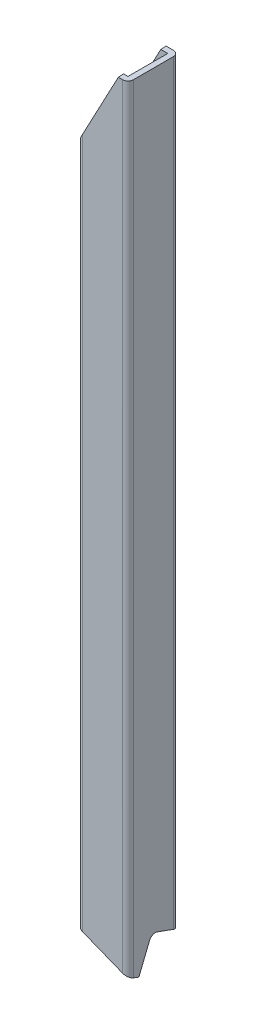
ISO-10303-21;
HEADER;
FILE_DESCRIPTION(('STEP AP214'),'2;1');
FILE_NAME('part.step','',(''),(''),'','','');
FILE_SCHEMA(('AUTOMOTIVE_DESIGN { 1 0 10303 214 1 1 1 1 }'));
ENDSEC;
DATA;
#1=APPLICATION_CONTEXT('core data for automotive mechanical design processes');
#2=APPLICATION_PROTOCOL_DEFINITION('international standard','automotive_design',2000,#1);
#3=PRODUCT_CONTEXT('',#1,'mechanical');
#4=PRODUCT('Part','Part','',(#3));
#5=PRODUCT_RELATED_PRODUCT_CATEGORY('part','',(#4));
#6=PRODUCT_DEFINITION_FORMATION('','',#4);
#7=PRODUCT_DEFINITION_CONTEXT('part definition',#1,'design');
#8=PRODUCT_DEFINITION('design','',#6,#7);
#9=PRODUCT_DEFINITION_SHAPE('','',#8);
#10=(LENGTH_UNIT() NAMED_UNIT(*) SI_UNIT(.MILLI.,.METRE.));
#11=(NAMED_UNIT(*) PLANE_ANGLE_UNIT() SI_UNIT($,.RADIAN.));
#12=(NAMED_UNIT(*) SI_UNIT($,.STERADIAN.) SOLID_ANGLE_UNIT());
#13=UNCERTAINTY_MEASURE_WITH_UNIT(LENGTH_MEASURE(1.E-05),#10,'distance_accuracy_value','');
#14=(GEOMETRIC_REPRESENTATION_CONTEXT(3) GLOBAL_UNCERTAINTY_ASSIGNED_CONTEXT((#13)) GLOBAL_UNIT_ASSIGNED_CONTEXT((#10,
#11,#12)) REPRESENTATION_CONTEXT('',''));
#15=CARTESIAN_POINT('',(0.,0.,0.));
#16=DIRECTION('',(0.,0.,1.));
#17=DIRECTION('',(1.,0.,0.));
#18=AXIS2_PLACEMENT_3D('',#15,#16,#17);
#19=CARTESIAN_POINT('',(0.,395.,2.80000000000002));
#20=DIRECTION('',(1.,0.,0.));
#21=DIRECTION('',(0.,0.,-1.));
#22=AXIS2_PLACEMENT_3D('',#19,#20,#21);
#23=PLANE('',#22);
#24=DIRECTION('',(0.,-0.339781072972034,-0.94050455737863));
#25=VECTOR('',#24,1.);
#26=CARTESIAN_POINT('',(0.,51.5098569819368,126.894506968996));
#27=LINE('',#26,#25);
#28=CARTESIAN_POINT('',(0.,13.9030819897967,22.8));
#29=VERTEX_POINT('',#28);
#30=CARTESIAN_POINT('',(0.,10.738801757909,14.041360347466));
#31=VERTEX_POINT('',#30);
#32=EDGE_CURVE('E50',#29,#31,#27,.T.);
#33=ORIENTED_EDGE('',*,*,#32,.F.);
#34=DIRECTION('',(0.,-1.,0.));
#35=VECTOR('',#34,1.);
#36=CARTESIAN_POINT('',(0.,395.,22.8));
#37=LINE('',#36,#35);
#38=CARTESIAN_POINT('',(0.,356.354468869818,22.8));
#39=VERTEX_POINT('',#38);
#40=EDGE_CURVE('E165',#39,#29,#37,.T.);
#41=ORIENTED_EDGE('',*,*,#40,.F.);
#42=DIRECTION('',(0.,-0.118459331661431,0.992958904860784));
#43=VECTOR('',#42,1.);
#44=CARTESIAN_POINT('',(0.,359.249271627046,-1.46503792728784));
#45=LINE('',#44,#43);
#46=CARTESIAN_POINT('',(0.,358.74045546164,2.80000000000002));
#47=VERTEX_POINT('',#46);
#48=EDGE_CURVE('E193',#47,#39,#45,.T.);
#49=ORIENTED_EDGE('',*,*,#48,.F.);
#50=DIRECTION('',(0.,-1.,0.));
#51=VECTOR('',#50,1.);
#52=CARTESIAN_POINT('',(0.,395.,2.80000000000002));
#53=LINE('',#52,#51);
#54=CARTESIAN_POINT('',(0.,25.0688961405451,2.80000000000002));
#55=VERTEX_POINT('',#54);
#56=EDGE_CURVE('E155',#47,#55,#53,.T.);
#57=ORIENTED_EDGE('',*,*,#56,.T.);
#58=DIRECTION('',(0.,-0.339781072972038,-0.940504557378629));
#59=VECTOR('',#58,1.);
#60=CARTESIAN_POINT('',(0.,67.7778776935013,121.017272787472));
#61=LINE('',#60,#59);
#62=CARTESIAN_POINT('',(0.,25.823172510031,4.88781600699379));
#63=VERTEX_POINT('',#62);
#64=EDGE_CURVE('E133',#63,#55,#61,.T.);
#65=ORIENTED_EDGE('',*,*,#64,.F.);
#66=CARTESIAN_POINT('',(0.,23.050786325766,6.01191657989972));
#67=DIRECTION('',(1.,0.,0.));
#68=DIRECTION('',(0.,0.795445386973202,-0.606025276983604));
#69=AXIS2_PLACEMENT_3D('',#66,#67,#68);
#70=ELLIPSE('',#69,3.0074321650704,2.8);
#71=CARTESIAN_POINT('',(0.,24.0079153506659,8.66122309377898));
#72=VERTEX_POINT('',#71);
#73=EDGE_CURVE('E128',#72,#63,#70,.F.);
#74=ORIENTED_EDGE('',*,*,#73,.F.);
#75=DIRECTION('',(0.,0.926720618835467,-0.375751107284077));
#76=VECTOR('',#75,1.);
#77=CARTESIAN_POINT('',(0.,344.661011065056,-121.351807068595));
#78=LINE('',#77,#76);
#79=EDGE_CURVE('E118',#31,#72,#78,.T.);
#80=ORIENTED_EDGE('',*,*,#79,.F.);
#81=EDGE_LOOP('',(#33,#41,#49,#57,#65,#74,#80));
#82=FACE_BOUND('',#81,.T.);
#83=ADVANCED_FACE('F35',(#82),#23,.F.);
#84=CARTESIAN_POINT('',(2.8,1040.5,2.8));
#85=DIRECTION('',(-1.,0.,0.));
#86=DIRECTION('',(0.,0.,1.));
#87=AXIS2_PLACEMENT_3D('',#84,#85,#86);
#88=PLANE('',#87);
#89=DIRECTION('',(0.,0.339781072972035,0.94050455737863));
#90=VECTOR('',#89,1.);
#91=CARTESIAN_POINT('',(2.79999999999989,125.048774587735,333.529922767316));
#92=LINE('',#91,#90);
#93=CARTESIAN_POINT('',(2.80000000000005,9.86574899603862,14.7065122868683));
#94=VERTEX_POINT('',#93);
#95=CARTESIAN_POINT('',(2.79999999999999,12.7897262566258,22.8));
#96=VERTEX_POINT('',#95);
#97=EDGE_CURVE('E284',#94,#96,#92,.T.);
#98=ORIENTED_EDGE('',*,*,#97,.F.);
#99=DIRECTION('',(0.,-0.926720618835467,0.375751107284077));
#100=VECTOR('',#99,1.);
#101=CARTESIAN_POINT('',(2.80000000000012,899.131930976477,-345.858199189307));
#102=LINE('',#101,#100);
#103=CARTESIAN_POINT('',(2.80000000000005,23.1348625887954,9.32637503318124));
#104=VERTEX_POINT('',#103);
#105=EDGE_CURVE('E124',#104,#94,#102,.T.);
#106=ORIENTED_EDGE('',*,*,#105,.F.);
#107=CARTESIAN_POINT('',(2.80000000000001,22.1777335638956,6.67706851930195));
#108=DIRECTION('',(-1.,0.,0.));
#109=DIRECTION('',(0.,0.795445386973202,-0.606025276983603));
#110=AXIS2_PLACEMENT_3D('',#107,#108,#109);
#111=ELLIPSE('',#110,3.0074321650704,2.8);
#112=CARTESIAN_POINT('',(2.80000000000001,24.9501197481607,5.55296794639603));
#113=VERTEX_POINT('',#112);
#114=EDGE_CURVE('E58',#113,#104,#111,.F.);
#115=ORIENTED_EDGE('',*,*,#114,.F.);
#116=DIRECTION('',(0.,0.339781072972038,0.940504557378629));
#117=VECTOR('',#116,1.);
#118=CARTESIAN_POINT('',(2.7999999999999,141.316795299301,327.652688585793));
#119=LINE('',#118,#117);
#120=CARTESIAN_POINT('',(2.80000000000002,23.9555404073746,2.8));
#121=VERTEX_POINT('',#120);
#122=EDGE_CURVE('E114',#121,#113,#119,.T.);
#123=ORIENTED_EDGE('',*,*,#122,.F.);
#124=DIRECTION('',(0.,-1.,0.));
#125=VECTOR('',#124,1.);
#126=CARTESIAN_POINT('',(2.8,1040.5,2.8));
#127=LINE('',#126,#125);
#128=CARTESIAN_POINT('',(2.8,364.002690521467,2.8));
#129=VERTEX_POINT('',#128);
#130=EDGE_CURVE('E166',#129,#121,#127,.T.);
#131=ORIENTED_EDGE('',*,*,#130,.F.);
#132=DIRECTION('',(0.,0.118459331661432,-0.992958904860784));
#133=VECTOR('',#132,1.);
#134=CARTESIAN_POINT('',(2.80000000000003,373.495715635236,-76.7731639591262));
#135=LINE('',#134,#133);
#136=CARTESIAN_POINT('',(2.79999999999995,361.616703929644,22.8));
#137=VERTEX_POINT('',#136);
#138=EDGE_CURVE('E186',#137,#129,#135,.T.);
#139=ORIENTED_EDGE('',*,*,#138,.F.);
#140=DIRECTION('',(0.,-1.,0.));
#141=VECTOR('',#140,1.);
#142=CARTESIAN_POINT('',(2.8,1040.5,22.8));
#143=LINE('',#142,#141);
#144=EDGE_CURVE('E162',#137,#96,#143,.T.);
#145=ORIENTED_EDGE('',*,*,#144,.T.);
#146=EDGE_LOOP('',(#98,#106,#115,#123,#131,#139,#145));
#147=FACE_BOUND('',#146,.T.);
#148=ADVANCED_FACE('F302',(#147),#88,.F.);
#149=CARTESIAN_POINT('',(25.6,395.,2.80000000000002));
#150=DIRECTION('',(-1.,0.,0.));
#151=DIRECTION('',(0.,0.,1.));
#152=AXIS2_PLACEMENT_3D('',#149,#150,#151);
#153=PLANE('',#152);
#154=DIRECTION('',(0.,0.339781072972034,0.94050455737863));
#155=VECTOR('',#154,1.);
#156=CARTESIAN_POINT('',(25.6,42.5058112425627,130.147446360317));
#157=LINE('',#156,#155);
#158=CARTESIAN_POINT('',(25.6,2.75660507795112,20.1227495077152));
#159=VERTEX_POINT('',#158);
#160=CARTESIAN_POINT('',(25.6,3.7238295722363,22.8));
#161=VERTEX_POINT('',#160);
#162=EDGE_CURVE('E260',#159,#161,#157,.T.);
#163=ORIENTED_EDGE('',*,*,#162,.F.);
#164=DIRECTION('',(0.,-0.926720618835467,0.375751107284077));
#165=VECTOR('',#164,1.);
#166=CARTESIAN_POINT('',(25.6,345.651652363288,-118.908573504821));
#167=LINE('',#166,#165);
#168=CARTESIAN_POINT('',(25.6,16.0257186707083,14.742612254028));
#169=VERTEX_POINT('',#168);
#170=EDGE_CURVE('E142',#169,#159,#167,.T.);
#171=ORIENTED_EDGE('',*,*,#170,.F.);
#172=CARTESIAN_POINT('',(25.6,15.0685896458084,12.0933057401487));
#173=DIRECTION('',(-1.,0.,0.));
#174=DIRECTION('',(0.,0.795445386973202,-0.606025276983604));
#175=AXIS2_PLACEMENT_3D('',#172,#173,#174);
#176=ELLIPSE('',#175,3.0074321650704,2.8);
#177=CARTESIAN_POINT('',(25.6,17.8409758300734,10.9692051672428));
#178=VERTEX_POINT('',#177);
#179=EDGE_CURVE('E76',#178,#169,#176,.F.);
#180=ORIENTED_EDGE('',*,*,#179,.F.);
#181=DIRECTION('',(0.,0.339781072972038,0.940504557378629));
#182=VECTOR('',#181,1.);
#183=CARTESIAN_POINT('',(25.6,58.7738319541276,124.270212178792));
#184=LINE('',#183,#182);
#185=CARTESIAN_POINT('',(25.6,14.889643722985,2.80000000000004));
#186=VERTEX_POINT('',#185);
#187=EDGE_CURVE('E96',#186,#178,#184,.T.);
#188=ORIENTED_EDGE('',*,*,#187,.F.);
#189=DIRECTION('',(0.,-1.,0.));
#190=VECTOR('',#189,1.);
#191=CARTESIAN_POINT('',(25.6,395.,2.80000000000002));
#192=LINE('',#191,#190);
#193=CARTESIAN_POINT('',(25.6,395.,2.80000000000002));
#194=VERTEX_POINT('',#193);
#195=EDGE_CURVE('E158',#194,#186,#192,.T.);
#196=ORIENTED_EDGE('',*,*,#195,.F.);
#197=DIRECTION('',(0.,0.,-1.));
#198=VECTOR('',#197,1.);
#199=CARTESIAN_POINT('',(25.6,395.,2.80000000000002));
#200=LINE('',#199,#198);
#201=CARTESIAN_POINT('',(25.6,395.,22.8));
#202=VERTEX_POINT('',#201);
#203=EDGE_CURVE('E230',#202,#194,#200,.T.);
#204=ORIENTED_EDGE('',*,*,#203,.F.);
#205=DIRECTION('',(0.,-1.,0.));
#206=VECTOR('',#205,1.);
#207=CARTESIAN_POINT('',(25.6,395.,22.8));
#208=LINE('',#207,#206);
#209=EDGE_CURVE('E161',#202,#161,#208,.T.);
#210=ORIENTED_EDGE('',*,*,#209,.T.);
#211=EDGE_LOOP('',(#163,#171,#180,#188,#196,#204,#210));
#212=FACE_BOUND('',#211,.T.);
#213=ADVANCED_FACE('F368',(#212),#153,.F.);
#214=CARTESIAN_POINT('',(22.8,1040.5,2.8));
#215=DIRECTION('',(1.,0.,0.));
#216=DIRECTION('',(0.,0.,-1.));
#217=AXIS2_PLACEMENT_3D('',#214,#215,#216);
#218=PLANE('',#217);
#219=DIRECTION('',(0.,-0.339781072972035,-0.94050455737863));
#220=VECTOR('',#219,1.);
#221=CARTESIAN_POINT('',(22.7999999999999,118.014363853849,336.071281666786));
#222=LINE('',#221,#220);
#223=CARTESIAN_POINT('',(22.8,4.83718530540692,22.8));
#224=VERTEX_POINT('',#223);
#225=CARTESIAN_POINT('',(22.8,3.62965783982142,19.457597568313));
#226=VERTEX_POINT('',#225);
#227=EDGE_CURVE('E275',#224,#226,#222,.T.);
#228=ORIENTED_EDGE('',*,*,#227,.F.);
#229=DIRECTION('',(0.,-1.,0.));
#230=VECTOR('',#229,1.);
#231=CARTESIAN_POINT('',(22.8,1040.5,22.8));
#232=LINE('',#231,#230);
#233=CARTESIAN_POINT('',(22.8,395.,22.8));
#234=VERTEX_POINT('',#233);
#235=EDGE_CURVE('E220',#234,#224,#232,.T.);
#236=ORIENTED_EDGE('',*,*,#235,.F.);
#237=DIRECTION('',(0.,0.,1.));
#238=VECTOR('',#237,1.);
#239=CARTESIAN_POINT('',(22.8,395.,2.8));
#240=LINE('',#239,#238);
#241=CARTESIAN_POINT('',(22.8,395.,2.8));
#242=VERTEX_POINT('',#241);
#243=EDGE_CURVE('E245',#242,#234,#240,.T.);
#244=ORIENTED_EDGE('',*,*,#243,.F.);
#245=DIRECTION('',(0.,-1.,0.));
#246=VECTOR('',#245,1.);
#247=CARTESIAN_POINT('',(22.8,1040.5,2.8));
#248=LINE('',#247,#246);
#249=CARTESIAN_POINT('',(22.8,16.0029994561558,2.79999999999997));
#250=VERTEX_POINT('',#249);
#251=EDGE_CURVE('E163',#242,#250,#248,.T.);
#252=ORIENTED_EDGE('',*,*,#251,.T.);
#253=DIRECTION('',(0.,-0.339781072972038,-0.940504557378629));
#254=VECTOR('',#253,1.);
#255=CARTESIAN_POINT('',(22.7999999999999,134.282384565416,330.194047485263));
#256=LINE('',#255,#254);
#257=CARTESIAN_POINT('',(22.8,18.7140285919438,10.3040532278406));
#258=VERTEX_POINT('',#257);
#259=EDGE_CURVE('E208',#258,#250,#256,.T.);
#260=ORIENTED_EDGE('',*,*,#259,.F.);
#261=CARTESIAN_POINT('',(22.8,15.9416424076788,11.4281538007465));
#262=DIRECTION('',(1.,0.,0.));
#263=DIRECTION('',(0.,0.795445386973202,-0.606025276983603));
#264=AXIS2_PLACEMENT_3D('',#261,#262,#263);
#265=ELLIPSE('',#264,3.0074321650704,2.8);
#266=CARTESIAN_POINT('',(22.8000000000001,16.8987714325785,14.0774603146258));
#267=VERTEX_POINT('',#266);
#268=EDGE_CURVE('E82',#267,#258,#265,.F.);
#269=ORIENTED_EDGE('',*,*,#268,.F.);
#270=DIRECTION('',(0.,0.926720618835467,-0.375751107284077));
#271=VECTOR('',#270,1.);
#272=CARTESIAN_POINT('',(22.8000000000001,899.90586949072,-343.949422967609));
#273=LINE('',#272,#271);
#274=EDGE_CURVE('E140',#226,#267,#273,.T.);
#275=ORIENTED_EDGE('',*,*,#274,.F.);
#276=EDGE_LOOP('',(#228,#236,#244,#252,#260,#269,#275));
#277=FACE_BOUND('',#276,.T.);
#278=ADVANCED_FACE('F352',(#277),#218,.F.);
#279=CARTESIAN_POINT('',(2.8,395.,22.8));
#280=DIRECTION('',(0.,-1.,0.));
#281=DIRECTION('',(0.,0.,-1.));
#282=AXIS2_PLACEMENT_3D('',#279,#280,#281);
#283=CYLINDRICAL_SURFACE('',#282,2.8);
#284=CARTESIAN_POINT('',(2.8,12.7897262566259,22.8));
#285=DIRECTION('',(-0.350277535577648,-0.880919790859939,0.318254568138355));
#286=DIRECTION('',(0.651994181632037,-0.473265593584914,-0.592387765780733));
#287=AXIS2_PLACEMENT_3D('',#284,#285,#286);
#288=ELLIPSE('',#287,3.17849596416342,2.8);
#289=CARTESIAN_POINT('',(2.80000000000002,13.8012971170303,25.6));
#290=VERTEX_POINT('',#289);
#291=EDGE_CURVE('E278',#290,#29,#288,.T.);
#292=ORIENTED_EDGE('',*,*,#291,.F.);
#293=DIRECTION('',(0.,-1.,0.));
#294=VECTOR('',#293,1.);
#295=CARTESIAN_POINT('',(2.80000000000002,395.,25.6));
#296=LINE('',#295,#294);
#297=CARTESIAN_POINT('',(2.80000000000002,361.282665806789,25.6));
#298=VERTEX_POINT('',#297);
#299=EDGE_CURVE('E185',#298,#290,#296,.T.);
#300=ORIENTED_EDGE('',*,*,#299,.F.);
#301=CARTESIAN_POINT('',(2.8,361.616703929644,22.8));
#302=DIRECTION('',(-0.881424160088028,0.468999886965857,0.055951372093341));
#303=DIRECTION('',(-0.468057814635929,-0.883198225782872,0.0297115488021969));
#304=AXIS2_PLACEMENT_3D('',#301,#302,#303);
#305=ELLIPSE('',#304,5.97015069260313,2.8);
#306=EDGE_CURVE('E145',#39,#298,#305,.T.);
#307=ORIENTED_EDGE('',*,*,#306,.F.);
#308=ORIENTED_EDGE('',*,*,#40,.T.);
#309=EDGE_LOOP('',(#292,#300,#307,#308));
#310=FACE_BOUND('',#309,.T.);
#311=ADVANCED_FACE('F403',(#310),#283,.T.);
#312=CARTESIAN_POINT('',(2.80000000000002,395.,25.6));
#313=DIRECTION('',(0.,0.,-1.));
#314=DIRECTION('',(-1.,0.,0.));
#315=AXIS2_PLACEMENT_3D('',#312,#313,#314);
#316=PLANE('',#315);
#317=DIRECTION('',(-0.929235100433151,0.369489009475237,0.));
#318=VECTOR('',#317,1.);
#319=CARTESIAN_POINT('',(-128.081584828129,65.8433552723374,25.6));
#320=LINE('',#319,#318);
#321=CARTESIAN_POINT('',(22.8,5.84875616581119,25.6));
#322=VERTEX_POINT('',#321);
#323=EDGE_CURVE('E266',#322,#290,#320,.T.);
#324=ORIENTED_EDGE('',*,*,#323,.F.);
#325=DIRECTION('',(0.,-1.,0.));
#326=VECTOR('',#325,1.);
#327=CARTESIAN_POINT('',(22.8,395.,25.6));
#328=LINE('',#327,#326);
#329=CARTESIAN_POINT('',(22.8,395.,25.6));
#330=VERTEX_POINT('',#329);
#331=EDGE_CURVE('E190',#330,#322,#328,.T.);
#332=ORIENTED_EDGE('',*,*,#331,.F.);
#333=DIRECTION('',(1.,0.,0.));
#334=VECTOR('',#333,1.);
#335=CARTESIAN_POINT('',(2.80000000000002,395.,25.6));
#336=LINE('',#335,#334);
#337=CARTESIAN_POINT('',(20.7407675004355,395.,25.6));
#338=VERTEX_POINT('',#337);
#339=EDGE_CURVE('E184',#338,#330,#336,.T.);
#340=ORIENTED_EDGE('',*,*,#339,.F.);
#341=DIRECTION('',(-0.469735730330699,-0.882807081785531,0.));
#342=VECTOR('',#341,1.);
#343=CARTESIAN_POINT('',(16.7821074352865,387.560214362585,25.6));
#344=LINE('',#343,#342);
#345=EDGE_CURVE('E179',#338,#298,#344,.T.);
#346=ORIENTED_EDGE('',*,*,#345,.T.);
#347=ORIENTED_EDGE('',*,*,#299,.T.);
#348=EDGE_LOOP('',(#324,#332,#340,#346,#347));
#349=FACE_BOUND('',#348,.T.);
#350=ADVANCED_FACE('F359',(#349),#316,.F.);
#351=CARTESIAN_POINT('',(2.8,1040.5,22.8));
#352=DIRECTION('',(0.,0.,1.));
#353=DIRECTION('',(1.,0.,0.));
#354=AXIS2_PLACEMENT_3D('',#351,#352,#353);
#355=PLANE('',#354);
#356=DIRECTION('',(0.929235100433151,-0.369489009475237,0.));
#357=VECTOR('',#356,1.);
#358=CARTESIAN_POINT('',(-350.05626198203,153.094919921934,22.7999999999999));
#359=LINE('',#358,#357);
#360=EDGE_CURVE('E280',#96,#224,#359,.T.);
#361=ORIENTED_EDGE('',*,*,#360,.F.);
#362=ORIENTED_EDGE('',*,*,#144,.F.);
#363=DIRECTION('',(0.469735730330699,0.88280708178553,0.));
#364=VECTOR('',#363,1.);
#365=CARTESIAN_POINT('',(284.323418407983,890.703276254193,22.8));
#366=LINE('',#365,#364);
#367=CARTESIAN_POINT('',(20.5630280544853,395.,22.8));
#368=VERTEX_POINT('',#367);
#369=EDGE_CURVE('E217',#137,#368,#366,.T.);
#370=ORIENTED_EDGE('',*,*,#369,.T.);
#371=DIRECTION('',(-1.,0.,0.));
#372=VECTOR('',#371,1.);
#373=CARTESIAN_POINT('',(22.8,395.,22.8));
#374=LINE('',#373,#372);
#375=EDGE_CURVE('E221',#234,#368,#374,.T.);
#376=ORIENTED_EDGE('',*,*,#375,.F.);
#377=ORIENTED_EDGE('',*,*,#235,.T.);
#378=EDGE_LOOP('',(#361,#362,#370,#376,#377));
#379=FACE_BOUND('',#378,.T.);
#380=ADVANCED_FACE('F298',(#379),#355,.F.);
#381=CARTESIAN_POINT('',(22.8,395.,22.8));
#382=DIRECTION('',(0.,-1.,0.));
#383=DIRECTION('',(0.,0.,-1.));
#384=AXIS2_PLACEMENT_3D('',#381,#382,#383);
#385=CYLINDRICAL_SURFACE('',#384,2.8);
#386=CARTESIAN_POINT('',(22.8,4.83718530540694,22.8));
#387=DIRECTION('',(-0.350277535577648,-0.880919790859939,0.318254568138355));
#388=DIRECTION('',(0.651994181632037,-0.473265593584914,-0.592387765780733));
#389=AXIS2_PLACEMENT_3D('',#386,#387,#388);
#390=ELLIPSE('',#389,3.17849596416342,2.8);
#391=EDGE_CURVE('E213',#161,#322,#390,.T.);
#392=ORIENTED_EDGE('',*,*,#391,.F.);
#393=ORIENTED_EDGE('',*,*,#209,.F.);
#394=CARTESIAN_POINT('',(22.8,395.,22.8));
#395=DIRECTION('',(0.,1.,0.));
#396=DIRECTION('',(0.,0.,1.));
#397=AXIS2_PLACEMENT_3D('',#394,#395,#396);
#398=CIRCLE('',#397,2.8);
#399=EDGE_CURVE('E234',#330,#202,#398,.T.);
#400=ORIENTED_EDGE('',*,*,#399,.F.);
#401=ORIENTED_EDGE('',*,*,#331,.T.);
#402=EDGE_LOOP('',(#392,#393,#400,#401));
#403=FACE_BOUND('',#402,.T.);
#404=ADVANCED_FACE('F363',(#403),#385,.T.);
#405=CARTESIAN_POINT('',(67.6178337512555,2.92436659772846,24.7241278287167));
#406=DIRECTION('',(0.102443699723494,-0.373774207099894,-0.921844960117377));
#407=DIRECTION('',(0.350277535577638,0.880919790859941,-0.318254568138359));
#408=AXIS2_PLACEMENT_3D('',#405,#406,#407);
#409=PLANE('',#408);
#410=ORIENTED_EDGE('',*,*,#170,.T.);
#411=DIRECTION('',(-0.931026818333721,0.290298405400594,-0.221169390660779));
#412=VECTOR('',#411,1.);
#413=CARTESIAN_POINT('',(62.9236671095872,-8.88108444103331,28.9891457804101));
#414=LINE('',#413,#412);
#415=EDGE_CURVE('E270',#159,#226,#414,.T.);
#416=ORIENTED_EDGE('',*,*,#415,.T.);
#417=ORIENTED_EDGE('',*,*,#274,.T.);
#418=DIRECTION('',(-0.931026818333725,0.290298405400585,-0.221169390660776));
#419=VECTOR('',#418,1.);
#420=CARTESIAN_POINT('',(67.6178337512555,2.92436659772846,24.7241278287167));
#421=LINE('',#420,#419);
#422=EDGE_CURVE('E130',#169,#267,#421,.T.);
#423=ORIENTED_EDGE('',*,*,#422,.F.);
#424=EDGE_LOOP('',(#410,#416,#417,#423));
#425=FACE_BOUND('',#424,.T.);
#426=ADVANCED_FACE('F393',(#425),#409,.T.);
#427=ORIENTED_EDGE('',*,*,#105,.T.);
#428=DIRECTION('',(-0.931026818333721,0.290298405400594,-0.221169390660779));
#429=VECTOR('',#428,1.);
#430=CARTESIAN_POINT('',(62.9236671095872,-8.88108444103331,28.9891457804101));
#431=LINE('',#430,#429);
#432=EDGE_CURVE('E12',#94,#31,#431,.T.);
#433=ORIENTED_EDGE('',*,*,#432,.T.);
#434=ORIENTED_EDGE('',*,*,#79,.T.);
#435=EDGE_CURVE('E43',#104,#72,#421,.T.);
#436=ORIENTED_EDGE('',*,*,#435,.F.);
#437=EDGE_LOOP('',(#427,#433,#434,#436));
#438=FACE_BOUND('',#437,.T.);
#439=ADVANCED_FACE('F120',(#438),#409,.T.);
#440=CARTESIAN_POINT('',(2.80000000000002,395.,0.));
#441=DIRECTION('',(0.,0.,1.));
#442=DIRECTION('',(1.,0.,0.));
#443=AXIS2_PLACEMENT_3D('',#440,#441,#442);
#444=PLANE('',#443);
#445=DIRECTION('',(0.929235100433155,-0.369489009475228,0.));
#446=VECTOR('',#445,1.);
#447=CARTESIAN_POINT('',(-124.942519956853,73.7378506054079,0.));
#448=LINE('',#447,#446);
#449=CARTESIAN_POINT('',(2.80000000000002,22.9439695469701,0.));
#450=VERTEX_POINT('',#449);
#451=CARTESIAN_POINT('',(22.8,14.9914285957513,0.));
#452=VERTEX_POINT('',#451);
#453=EDGE_CURVE('E205',#450,#452,#448,.T.);
#454=ORIENTED_EDGE('',*,*,#453,.F.);
#455=DIRECTION('',(0.,-1.,0.));
#456=VECTOR('',#455,1.);
#457=CARTESIAN_POINT('',(2.80000000000002,395.,0.));
#458=LINE('',#457,#456);
#459=CARTESIAN_POINT('',(2.80000000000002,364.336728644322,0.));
#460=VERTEX_POINT('',#459);
#461=EDGE_CURVE('E151',#460,#450,#458,.T.);
#462=ORIENTED_EDGE('',*,*,#461,.F.);
#463=DIRECTION('',(0.469735730330699,0.882807081785531,0.));
#464=VECTOR('',#463,1.);
#465=CARTESIAN_POINT('',(15.5156302439462,388.234098386281,0.));
#466=LINE('',#465,#464);
#467=CARTESIAN_POINT('',(19.1157211374603,395.,0.));
#468=VERTEX_POINT('',#467);
#469=EDGE_CURVE('E152',#460,#468,#466,.T.);
#470=ORIENTED_EDGE('',*,*,#469,.T.);
#471=DIRECTION('',(-1.,0.,0.));
#472=VECTOR('',#471,1.);
#473=CARTESIAN_POINT('',(2.80000000000002,395.,0.));
#474=LINE('',#473,#472);
#475=CARTESIAN_POINT('',(22.8,395.,0.));
#476=VERTEX_POINT('',#475);
#477=EDGE_CURVE('E239',#476,#468,#474,.T.);
#478=ORIENTED_EDGE('',*,*,#477,.F.);
#479=DIRECTION('',(0.,-1.,0.));
#480=VECTOR('',#479,1.);
#481=CARTESIAN_POINT('',(22.8,395.,0.));
#482=LINE('',#481,#480);
#483=EDGE_CURVE('E148',#476,#452,#482,.T.);
#484=ORIENTED_EDGE('',*,*,#483,.T.);
#485=EDGE_LOOP('',(#454,#462,#470,#478,#484));
#486=FACE_BOUND('',#485,.T.);
#487=ADVANCED_FACE('F37',(#486),#444,.F.);
#488=CARTESIAN_POINT('',(2.8,395.,2.8));
#489=DIRECTION('',(0.,-1.,0.));
#490=DIRECTION('',(0.,0.,-1.));
#491=AXIS2_PLACEMENT_3D('',#488,#489,#490);
#492=CYLINDRICAL_SURFACE('',#491,2.8);
#493=CARTESIAN_POINT('',(2.8,23.9555404073745,2.8));
#494=DIRECTION('',(-0.350277535577638,-0.880919790859941,0.318254568138359));
#495=DIRECTION('',(0.651994181632027,-0.47326559358491,-0.592387765780748));
#496=AXIS2_PLACEMENT_3D('',#493,#494,#495);
#497=ELLIPSE('',#496,3.17849596416341,2.8);
#498=EDGE_CURVE('E202',#55,#450,#497,.T.);
#499=ORIENTED_EDGE('',*,*,#498,.F.);
#500=ORIENTED_EDGE('',*,*,#56,.F.);
#501=CARTESIAN_POINT('',(2.8,364.002690521467,2.8));
#502=DIRECTION('',(-0.881424160088028,0.468999886965857,0.055951372093341));
#503=DIRECTION('',(-0.468057814635929,-0.883198225782872,0.0297115488021969));
#504=AXIS2_PLACEMENT_3D('',#501,#502,#503);
#505=ELLIPSE('',#504,5.97015069260313,2.8);
#506=EDGE_CURVE('E196',#460,#47,#505,.T.);
#507=ORIENTED_EDGE('',*,*,#506,.F.);
#508=ORIENTED_EDGE('',*,*,#461,.T.);
#509=EDGE_LOOP('',(#499,#500,#507,#508));
#510=FACE_BOUND('',#509,.T.);
#511=ADVANCED_FACE('F343',(#510),#492,.T.);
#512=CARTESIAN_POINT('',(2.8,1040.5,2.8));
#513=DIRECTION('',(0.,0.,-1.));
#514=DIRECTION('',(-1.,0.,0.));
#515=AXIS2_PLACEMENT_3D('',#512,#513,#514);
#516=PLANE('',#515);
#517=DIRECTION('',(-0.929235100433154,0.369489009475228,0.));
#518=VECTOR('',#517,1.);
#519=CARTESIAN_POINT('',(-346.222567268757,162.73635336259,2.79999999999994));
#520=LINE('',#519,#518);
#521=EDGE_CURVE('E111',#250,#121,#520,.T.);
#522=ORIENTED_EDGE('',*,*,#521,.F.);
#523=ORIENTED_EDGE('',*,*,#251,.F.);
#524=DIRECTION('',(1.,0.,0.));
#525=VECTOR('',#524,1.);
#526=CARTESIAN_POINT('',(22.8,395.,2.8));
#527=LINE('',#526,#525);
#528=CARTESIAN_POINT('',(19.2934605834108,395.,2.8));
#529=VERTEX_POINT('',#528);
#530=EDGE_CURVE('E242',#529,#242,#527,.T.);
#531=ORIENTED_EDGE('',*,*,#530,.F.);
#532=DIRECTION('',(-0.469735730330699,-0.88280708178553,0.));
#533=VECTOR('',#532,1.);
#534=CARTESIAN_POINT('',(283.333983102248,891.229748147706,2.80000000000004));
#535=LINE('',#534,#533);
#536=EDGE_CURVE('E157',#529,#129,#535,.T.);
#537=ORIENTED_EDGE('',*,*,#536,.T.);
#538=ORIENTED_EDGE('',*,*,#130,.T.);
#539=EDGE_LOOP('',(#522,#523,#531,#537,#538));
#540=FACE_BOUND('',#539,.T.);
#541=ADVANCED_FACE('F350',(#540),#516,.F.);
#542=CARTESIAN_POINT('',(22.8,395.,2.8));
#543=DIRECTION('',(0.,-1.,0.));
#544=DIRECTION('',(0.,0.,-1.));
#545=AXIS2_PLACEMENT_3D('',#542,#543,#544);
#546=CYLINDRICAL_SURFACE('',#545,2.8);
#547=CARTESIAN_POINT('',(22.8,16.0029994561557,2.8));
#548=DIRECTION('',(-0.350277535577638,-0.880919790859941,0.318254568138359));
#549=DIRECTION('',(0.651994181632027,-0.47326559358491,-0.592387765780748));
#550=AXIS2_PLACEMENT_3D('',#547,#548,#549);
#551=ELLIPSE('',#550,3.17849596416341,2.8);
#552=EDGE_CURVE('E104',#452,#186,#551,.T.);
#553=ORIENTED_EDGE('',*,*,#552,.F.);
#554=ORIENTED_EDGE('',*,*,#483,.F.);
#555=CARTESIAN_POINT('',(22.8,395.,2.8));
#556=DIRECTION('',(0.,1.,0.));
#557=DIRECTION('',(0.,0.,-1.));
#558=AXIS2_PLACEMENT_3D('',#555,#556,#557);
#559=CIRCLE('',#558,2.8);
#560=EDGE_CURVE('E233',#194,#476,#559,.T.);
#561=ORIENTED_EDGE('',*,*,#560,.F.);
#562=ORIENTED_EDGE('',*,*,#195,.T.);
#563=EDGE_LOOP('',(#553,#554,#561,#562));
#564=FACE_BOUND('',#563,.T.);
#565=ADVANCED_FACE('F370',(#564),#546,.T.);
#566=CARTESIAN_POINT('',(22.8,395.,2.8));
#567=DIRECTION('',(0.,-1.,0.));
#568=DIRECTION('',(0.,0.,-1.));
#569=AXIS2_PLACEMENT_3D('',#566,#567,#568);
#570=PLANE('',#569);
#571=DIRECTION('',(0.06335086559277,0.,0.997991316509641));
#572=VECTOR('',#571,1.);
#573=CARTESIAN_POINT('',(19.3075334908615,395.,3.02169609369096));
#574=LINE('',#573,#572);
#575=EDGE_CURVE('E181',#368,#338,#574,.T.);
#576=ORIENTED_EDGE('',*,*,#575,.T.);
#577=ORIENTED_EDGE('',*,*,#339,.T.);
#578=ORIENTED_EDGE('',*,*,#399,.T.);
#579=ORIENTED_EDGE('',*,*,#203,.T.);
#580=ORIENTED_EDGE('',*,*,#560,.T.);
#581=ORIENTED_EDGE('',*,*,#477,.T.);
#582=DIRECTION('',(-0.063350865592767,0.,-0.997991316509641));
#583=VECTOR('',#582,1.);
#584=CARTESIAN_POINT('',(19.3075334908614,395.,3.02169609369095));
#585=LINE('',#584,#583);
#586=EDGE_CURVE('E189',#529,#468,#585,.T.);
#587=ORIENTED_EDGE('',*,*,#586,.F.);
#588=ORIENTED_EDGE('',*,*,#530,.T.);
#589=ORIENTED_EDGE('',*,*,#243,.T.);
#590=ORIENTED_EDGE('',*,*,#375,.T.);
#591=EDGE_LOOP('',(#576,#577,#578,#579,#580,#581,#587,#588,#589,#590));
#592=FACE_BOUND('',#591,.T.);
#593=ADVANCED_FACE('F347',(#592),#570,.F.);
#594=CARTESIAN_POINT('',(-20.916702297544,339.965130763059,-169.329140586136));
#595=DIRECTION('',(0.881424160088027,-0.468999886965858,-0.0559513720933436));
#596=DIRECTION('',(0.448001363104984,0.867670060947867,-0.215507410524098));
#597=AXIS2_PLACEMENT_3D('',#594,#595,#596);
#598=PLANE('',#597);
#599=ORIENTED_EDGE('',*,*,#138,.T.);
#600=ORIENTED_EDGE('',*,*,#536,.F.);
#601=ORIENTED_EDGE('',*,*,#586,.T.);
#602=ORIENTED_EDGE('',*,*,#469,.F.);
#603=ORIENTED_EDGE('',*,*,#506,.T.);
#604=ORIENTED_EDGE('',*,*,#48,.T.);
#605=ORIENTED_EDGE('',*,*,#306,.T.);
#606=ORIENTED_EDGE('',*,*,#345,.F.);
#607=ORIENTED_EDGE('',*,*,#575,.F.);
#608=ORIENTED_EDGE('',*,*,#369,.F.);
#609=EDGE_LOOP('',(#599,#600,#601,#602,#603,#604,#605,#606,#607,#608));
#610=FACE_BOUND('',#609,.T.);
#611=ADVANCED_FACE('F307',(#610),#598,.F.);
#612=CARTESIAN_POINT('',(67.9046761104812,1.87779881784877,22.1429619403881));
#613=DIRECTION('',(-0.931026818333725,0.290298405400585,-0.221169390660776));
#614=DIRECTION('',(0.350277535577638,0.880919790859941,-0.318254568138359));
#615=AXIS2_PLACEMENT_3D('',#612,#613,#614);
#616=CYLINDRICAL_SURFACE('',#615,2.8);
#617=ORIENTED_EDGE('',*,*,#179,.T.);
#618=ORIENTED_EDGE('',*,*,#422,.T.);
#619=ORIENTED_EDGE('',*,*,#268,.T.);
#620=DIRECTION('',(-0.931026818333725,0.290298405400585,-0.221169390660776));
#621=VECTOR('',#620,1.);
#622=CARTESIAN_POINT('',(68.8854532100986,4.3443742322566,21.2518491496006));
#623=LINE('',#622,#621);
#624=EDGE_CURVE('E146',#178,#258,#623,.T.);
#625=ORIENTED_EDGE('',*,*,#624,.F.);
#626=EDGE_LOOP('',(#617,#618,#619,#625));
#627=FACE_BOUND('',#626,.T.);
#628=ADVANCED_FACE('F464',(#627),#616,.F.);
#629=CARTESIAN_POINT('',(68.8854532100986,4.3443742322566,21.2518491496006));
#630=DIRECTION('',(-0.350277535577638,-0.880919790859941,0.318254568138359));
#631=DIRECTION('',(0.102443699723494,-0.373774207099894,-0.921844960117377));
#632=AXIS2_PLACEMENT_3D('',#629,#630,#631);
#633=PLANE('',#632);
#634=ORIENTED_EDGE('',*,*,#64,.T.);
#635=ORIENTED_EDGE('',*,*,#498,.T.);
#636=ORIENTED_EDGE('',*,*,#453,.T.);
#637=ORIENTED_EDGE('',*,*,#552,.T.);
#638=ORIENTED_EDGE('',*,*,#187,.T.);
#639=ORIENTED_EDGE('',*,*,#624,.T.);
#640=ORIENTED_EDGE('',*,*,#259,.T.);
#641=ORIENTED_EDGE('',*,*,#521,.T.);
#642=ORIENTED_EDGE('',*,*,#122,.T.);
#643=EDGE_CURVE('E125',#113,#63,#623,.T.);
#644=ORIENTED_EDGE('',*,*,#643,.T.);
#645=EDGE_LOOP('',(#634,#635,#636,#637,#638,#639,#640,#641,#642,#644));
#646=FACE_BOUND('',#645,.T.);
#647=ADVANCED_FACE('F338',(#646),#633,.T.);
#648=ORIENTED_EDGE('',*,*,#73,.T.);
#649=ORIENTED_EDGE('',*,*,#643,.F.);
#650=ORIENTED_EDGE('',*,*,#114,.T.);
#651=ORIENTED_EDGE('',*,*,#435,.T.);
#652=EDGE_LOOP('',(#648,#649,#650,#651));
#653=FACE_BOUND('',#652,.T.);
#654=ADVANCED_FACE('F127',(#653),#616,.F.);
#655=CARTESIAN_POINT('',(1.74833883601983,4.39693136255232,-1.58850272912709));
#656=DIRECTION('',(-0.350277535577648,-0.880919790859939,0.318254568138355));
#657=DIRECTION('',(0.929235100433151,-0.369489009475237,0.));
#658=AXIS2_PLACEMENT_3D('',#655,#656,#657);
#659=PLANE('',#658);
#660=ORIENTED_EDGE('',*,*,#162,.T.);
#661=ORIENTED_EDGE('',*,*,#391,.T.);
#662=ORIENTED_EDGE('',*,*,#323,.T.);
#663=ORIENTED_EDGE('',*,*,#291,.T.);
#664=ORIENTED_EDGE('',*,*,#32,.T.);
#665=ORIENTED_EDGE('',*,*,#432,.F.);
#666=ORIENTED_EDGE('',*,*,#97,.T.);
#667=ORIENTED_EDGE('',*,*,#360,.T.);
#668=ORIENTED_EDGE('',*,*,#227,.T.);
#669=ORIENTED_EDGE('',*,*,#415,.F.);
#670=EDGE_LOOP('',(#660,#661,#662,#663,#664,#665,#666,#667,#668,#669));
#671=FACE_BOUND('',#670,.T.);
#672=ADVANCED_FACE('F289',(#671),#659,.T.);
#673=CLOSED_SHELL('',(#83,#148,#213,#278,#311,#350,#380,#404,#426,#439,#487,#511,#541,#565,#593,
#611,#628,#647,#654,#672));
#674=MANIFOLD_SOLID_BREP('B2',#673);
#675=ADVANCED_BREP_SHAPE_REPRESENTATION('',(#18,#674),#14);
#676=SHAPE_DEFINITION_REPRESENTATION(#9,#675);
ENDSEC;
END-ISO-10303-21;
